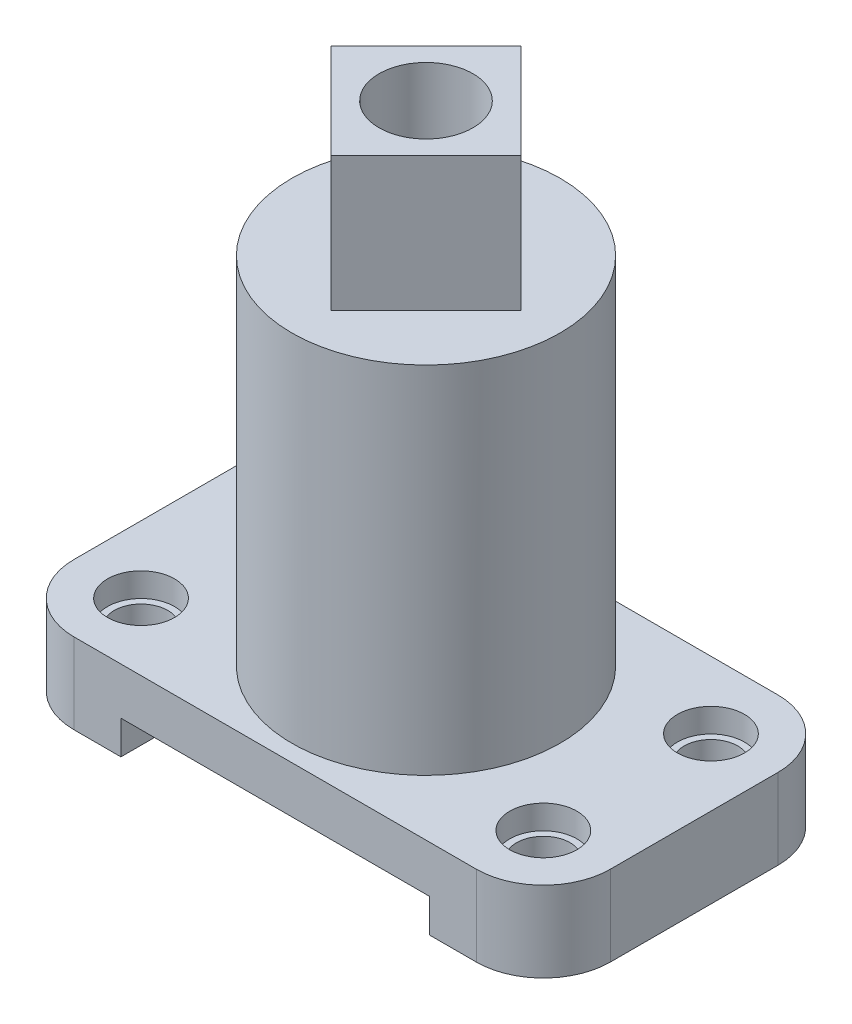
ISO-10303-21;
HEADER;
FILE_DESCRIPTION(('STEP AP214'),'2;1');
FILE_NAME('part.step','',(''),(''),'','','');
FILE_SCHEMA(('AUTOMOTIVE_DESIGN { 1 0 10303 214 1 1 1 1 }'));
ENDSEC;
DATA;
#1=APPLICATION_CONTEXT('core data for automotive mechanical design processes');
#2=APPLICATION_PROTOCOL_DEFINITION('international standard','automotive_design',2000,#1);
#3=PRODUCT_CONTEXT('',#1,'mechanical');
#4=PRODUCT('Part','Part','',(#3));
#5=PRODUCT_RELATED_PRODUCT_CATEGORY('part','',(#4));
#6=PRODUCT_DEFINITION_FORMATION('','',#4);
#7=PRODUCT_DEFINITION_CONTEXT('part definition',#1,'design');
#8=PRODUCT_DEFINITION('design','',#6,#7);
#9=PRODUCT_DEFINITION_SHAPE('','',#8);
#10=(LENGTH_UNIT() NAMED_UNIT(*) SI_UNIT(.MILLI.,.METRE.));
#11=(NAMED_UNIT(*) PLANE_ANGLE_UNIT() SI_UNIT($,.RADIAN.));
#12=(NAMED_UNIT(*) SI_UNIT($,.STERADIAN.) SOLID_ANGLE_UNIT());
#13=UNCERTAINTY_MEASURE_WITH_UNIT(LENGTH_MEASURE(1.E-05),#10,'distance_accuracy_value','');
#14=(GEOMETRIC_REPRESENTATION_CONTEXT(3) GLOBAL_UNCERTAINTY_ASSIGNED_CONTEXT((#13)) GLOBAL_UNIT_ASSIGNED_CONTEXT((#10,
#11,#12)) REPRESENTATION_CONTEXT('',''));
#15=CARTESIAN_POINT('',(0.,0.,0.));
#16=DIRECTION('',(0.,0.,1.));
#17=DIRECTION('',(1.,0.,0.));
#18=AXIS2_PLACEMENT_3D('',#15,#16,#17);
#19=CARTESIAN_POINT('',(30.,0.,-12.5));
#20=DIRECTION('',(0.,-1.,0.));
#21=DIRECTION('',(0.,0.,-1.));
#22=AXIS2_PLACEMENT_3D('',#19,#20,#21);
#23=PLANE('',#22);
#24=DIRECTION('',(0.,0.,1.));
#25=VECTOR('',#24,1.);
#26=CARTESIAN_POINT('',(23.,0.,-12.5));
#27=LINE('',#26,#25);
#28=CARTESIAN_POINT('',(23.,0.,-22.5));
#29=VERTEX_POINT('',#28);
#30=CARTESIAN_POINT('',(23.,0.,22.5));
#31=VERTEX_POINT('',#30);
#32=EDGE_CURVE('E11',#29,#31,#27,.T.);
#33=ORIENTED_EDGE('',*,*,#32,.F.);
#34=DIRECTION('',(-1.,0.,0.));
#35=VECTOR('',#34,1.);
#36=CARTESIAN_POINT('',(-29.9999999999999,0.,-22.5));
#37=LINE('',#36,#35);
#38=CARTESIAN_POINT('',(29.9999999999999,0.,-22.5));
#39=VERTEX_POINT('',#38);
#40=EDGE_CURVE('E171',#39,#29,#37,.T.);
#41=ORIENTED_EDGE('',*,*,#40,.F.);
#42=CARTESIAN_POINT('',(30.,0.,-12.5));
#43=DIRECTION('',(0.,1.,0.));
#44=DIRECTION('',(0.,0.,-1.));
#45=AXIS2_PLACEMENT_3D('',#42,#43,#44);
#46=CIRCLE('',#45,10.);
#47=CARTESIAN_POINT('',(40.,0.,-12.4999999999999));
#48=VERTEX_POINT('',#47);
#49=EDGE_CURVE('E277',#48,#39,#46,.T.);
#50=ORIENTED_EDGE('',*,*,#49,.F.);
#51=DIRECTION('',(0.,0.,-1.));
#52=VECTOR('',#51,1.);
#53=CARTESIAN_POINT('',(40.,0.,12.4999999999999));
#54=LINE('',#53,#52);
#55=CARTESIAN_POINT('',(40.,0.,12.4999999999999));
#56=VERTEX_POINT('',#55);
#57=EDGE_CURVE('E282',#56,#48,#54,.T.);
#58=ORIENTED_EDGE('',*,*,#57,.F.);
#59=CARTESIAN_POINT('',(30.,0.,12.5));
#60=DIRECTION('',(0.,1.,0.));
#61=DIRECTION('',(0.,0.,1.));
#62=AXIS2_PLACEMENT_3D('',#59,#60,#61);
#63=CIRCLE('',#62,10.);
#64=CARTESIAN_POINT('',(29.9999999999999,0.,22.5));
#65=VERTEX_POINT('',#64);
#66=EDGE_CURVE('E311',#65,#56,#63,.T.);
#67=ORIENTED_EDGE('',*,*,#66,.F.);
#68=DIRECTION('',(1.,0.,0.));
#69=VECTOR('',#68,1.);
#70=CARTESIAN_POINT('',(-29.9999999999999,0.,22.5));
#71=LINE('',#70,#69);
#72=EDGE_CURVE('E307',#31,#65,#71,.T.);
#73=ORIENTED_EDGE('',*,*,#72,.F.);
#74=EDGE_LOOP('',(#33,#41,#50,#58,#67,#73));
#75=FACE_BOUND('',#74,.T.);
#76=CARTESIAN_POINT('',(30.,0.,12.5));
#77=DIRECTION('',(0.,1.,0.));
#78=DIRECTION('',(0.,0.,1.));
#79=AXIS2_PLACEMENT_3D('',#76,#77,#78);
#80=CIRCLE('',#79,4.);
#81=CARTESIAN_POINT('',(30.,0.,16.5));
#82=VERTEX_POINT('',#81);
#83=EDGE_CURVE('E274',#82,#82,#80,.T.);
#84=ORIENTED_EDGE('',*,*,#83,.T.);
#85=EDGE_LOOP('',(#84));
#86=FACE_BOUND('',#85,.T.);
#87=CARTESIAN_POINT('',(30.,0.,-12.5));
#88=DIRECTION('',(0.,1.,0.));
#89=DIRECTION('',(0.,0.,1.));
#90=AXIS2_PLACEMENT_3D('',#87,#88,#89);
#91=CIRCLE('',#90,4.);
#92=CARTESIAN_POINT('',(30.,0.,-8.5));
#93=VERTEX_POINT('',#92);
#94=EDGE_CURVE('E262',#93,#93,#91,.T.);
#95=ORIENTED_EDGE('',*,*,#94,.T.);
#96=EDGE_LOOP('',(#95));
#97=FACE_BOUND('',#96,.T.);
#98=ADVANCED_FACE('F33',(#75,#86,#97),#23,.T.);
#99=CARTESIAN_POINT('',(30.,12.,-12.5));
#100=DIRECTION('',(0.,-1.,0.));
#101=DIRECTION('',(0.,0.,-1.));
#102=AXIS2_PLACEMENT_3D('',#99,#100,#101);
#103=CYLINDRICAL_SURFACE('',#102,10.);
#104=ORIENTED_EDGE('',*,*,#49,.T.);
#105=DIRECTION('',(0.,-1.,0.));
#106=VECTOR('',#105,1.);
#107=CARTESIAN_POINT('',(29.9999999999999,12.,-22.5));
#108=LINE('',#107,#106);
#109=CARTESIAN_POINT('',(29.9999999999999,12.,-22.5));
#110=VERTEX_POINT('',#109);
#111=EDGE_CURVE('E334',#110,#39,#108,.T.);
#112=ORIENTED_EDGE('',*,*,#111,.F.);
#113=CARTESIAN_POINT('',(30.,12.,-12.5));
#114=DIRECTION('',(0.,1.,0.));
#115=DIRECTION('',(0.,0.,-1.));
#116=AXIS2_PLACEMENT_3D('',#113,#114,#115);
#117=CIRCLE('',#116,10.);
#118=CARTESIAN_POINT('',(40.,12.,-12.4999999999999));
#119=VERTEX_POINT('',#118);
#120=EDGE_CURVE('E278',#119,#110,#117,.T.);
#121=ORIENTED_EDGE('',*,*,#120,.F.);
#122=DIRECTION('',(0.,-1.,0.));
#123=VECTOR('',#122,1.);
#124=CARTESIAN_POINT('',(40.,12.,-12.4999999999999));
#125=LINE('',#124,#123);
#126=EDGE_CURVE('E296',#119,#48,#125,.T.);
#127=ORIENTED_EDGE('',*,*,#126,.T.);
#128=EDGE_LOOP('',(#104,#112,#121,#127));
#129=FACE_BOUND('',#128,.T.);
#130=ADVANCED_FACE('F35',(#129),#103,.T.);
#131=CARTESIAN_POINT('',(-29.9999999999999,12.,-22.5));
#132=DIRECTION('',(0.,0.,1.));
#133=DIRECTION('',(1.,0.,0.));
#134=AXIS2_PLACEMENT_3D('',#131,#132,#133);
#135=PLANE('',#134);
#136=ORIENTED_EDGE('',*,*,#40,.T.);
#137=DIRECTION('',(0.,1.,0.));
#138=VECTOR('',#137,1.);
#139=CARTESIAN_POINT('',(23.,-5.,-22.5));
#140=LINE('',#139,#138);
#141=CARTESIAN_POINT('',(23.,5.,-22.5));
#142=VERTEX_POINT('',#141);
#143=EDGE_CURVE('E151',#29,#142,#140,.T.);
#144=ORIENTED_EDGE('',*,*,#143,.T.);
#145=DIRECTION('',(-1.,0.,0.));
#146=VECTOR('',#145,1.);
#147=CARTESIAN_POINT('',(-23.,5.,-22.5));
#148=LINE('',#147,#146);
#149=CARTESIAN_POINT('',(-23.,5.,-22.5));
#150=VERTEX_POINT('',#149);
#151=EDGE_CURVE('E162',#142,#150,#148,.T.);
#152=ORIENTED_EDGE('',*,*,#151,.T.);
#153=DIRECTION('',(0.,-1.,0.));
#154=VECTOR('',#153,1.);
#155=CARTESIAN_POINT('',(-23.,-5.,-22.5));
#156=LINE('',#155,#154);
#157=CARTESIAN_POINT('',(-23.,0.,-22.5));
#158=VERTEX_POINT('',#157);
#159=EDGE_CURVE('E159',#150,#158,#156,.T.);
#160=ORIENTED_EDGE('',*,*,#159,.T.);
#161=CARTESIAN_POINT('',(-29.9999999999999,0.,-22.5));
#162=VERTEX_POINT('',#161);
#163=EDGE_CURVE('E299',#158,#162,#37,.T.);
#164=ORIENTED_EDGE('',*,*,#163,.T.);
#165=DIRECTION('',(0.,-1.,0.));
#166=VECTOR('',#165,1.);
#167=CARTESIAN_POINT('',(-29.9999999999999,12.,-22.5));
#168=LINE('',#167,#166);
#169=CARTESIAN_POINT('',(-29.9999999999999,12.,-22.5));
#170=VERTEX_POINT('',#169);
#171=EDGE_CURVE('E331',#170,#162,#168,.T.);
#172=ORIENTED_EDGE('',*,*,#171,.F.);
#173=DIRECTION('',(-1.,0.,0.));
#174=VECTOR('',#173,1.);
#175=CARTESIAN_POINT('',(-29.9999999999999,12.,-22.5));
#176=LINE('',#175,#174);
#177=EDGE_CURVE('E281',#110,#170,#176,.T.);
#178=ORIENTED_EDGE('',*,*,#177,.F.);
#179=ORIENTED_EDGE('',*,*,#111,.T.);
#180=EDGE_LOOP('',(#136,#144,#152,#160,#164,#172,#178,#179));
#181=FACE_BOUND('',#180,.T.);
#182=ADVANCED_FACE('F169',(#181),#135,.F.);
#183=CARTESIAN_POINT('',(-30.,12.,-12.5));
#184=DIRECTION('',(0.,-1.,0.));
#185=DIRECTION('',(0.,0.,-1.));
#186=AXIS2_PLACEMENT_3D('',#183,#184,#185);
#187=CYLINDRICAL_SURFACE('',#186,10.);
#188=CARTESIAN_POINT('',(-30.,0.,-12.5));
#189=DIRECTION('',(0.,1.,0.));
#190=DIRECTION('',(0.,0.,-1.));
#191=AXIS2_PLACEMENT_3D('',#188,#189,#190);
#192=CIRCLE('',#191,10.);
#193=CARTESIAN_POINT('',(-40.,0.,-12.4999999999999));
#194=VERTEX_POINT('',#193);
#195=EDGE_CURVE('E301',#162,#194,#192,.T.);
#196=ORIENTED_EDGE('',*,*,#195,.T.);
#197=DIRECTION('',(0.,-1.,0.));
#198=VECTOR('',#197,1.);
#199=CARTESIAN_POINT('',(-40.,12.,-12.4999999999999));
#200=LINE('',#199,#198);
#201=CARTESIAN_POINT('',(-40.,12.,-12.4999999999999));
#202=VERTEX_POINT('',#201);
#203=EDGE_CURVE('E328',#202,#194,#200,.T.);
#204=ORIENTED_EDGE('',*,*,#203,.F.);
#205=CARTESIAN_POINT('',(-30.,12.,-12.5));
#206=DIRECTION('',(0.,1.,0.));
#207=DIRECTION('',(0.,0.,-1.));
#208=AXIS2_PLACEMENT_3D('',#205,#206,#207);
#209=CIRCLE('',#208,10.);
#210=EDGE_CURVE('E284',#170,#202,#209,.T.);
#211=ORIENTED_EDGE('',*,*,#210,.F.);
#212=ORIENTED_EDGE('',*,*,#171,.T.);
#213=EDGE_LOOP('',(#196,#204,#211,#212));
#214=FACE_BOUND('',#213,.T.);
#215=ADVANCED_FACE('F352',(#214),#187,.T.);
#216=CARTESIAN_POINT('',(-40.,12.,12.4999999999999));
#217=DIRECTION('',(1.,0.,0.));
#218=DIRECTION('',(0.,0.,-1.));
#219=AXIS2_PLACEMENT_3D('',#216,#217,#218);
#220=PLANE('',#219);
#221=DIRECTION('',(0.,0.,1.));
#222=VECTOR('',#221,1.);
#223=CARTESIAN_POINT('',(-40.,0.,12.4999999999999));
#224=LINE('',#223,#222);
#225=CARTESIAN_POINT('',(-40.,0.,12.4999999999999));
#226=VERTEX_POINT('',#225);
#227=EDGE_CURVE('E303',#194,#226,#224,.T.);
#228=ORIENTED_EDGE('',*,*,#227,.T.);
#229=DIRECTION('',(0.,-1.,0.));
#230=VECTOR('',#229,1.);
#231=CARTESIAN_POINT('',(-40.,12.,12.4999999999999));
#232=LINE('',#231,#230);
#233=CARTESIAN_POINT('',(-40.,12.,12.4999999999999));
#234=VERTEX_POINT('',#233);
#235=EDGE_CURVE('E325',#234,#226,#232,.T.);
#236=ORIENTED_EDGE('',*,*,#235,.F.);
#237=DIRECTION('',(0.,0.,1.));
#238=VECTOR('',#237,1.);
#239=CARTESIAN_POINT('',(-40.,12.,12.4999999999999));
#240=LINE('',#239,#238);
#241=EDGE_CURVE('E286',#202,#234,#240,.T.);
#242=ORIENTED_EDGE('',*,*,#241,.F.);
#243=ORIENTED_EDGE('',*,*,#203,.T.);
#244=EDGE_LOOP('',(#228,#236,#242,#243));
#245=FACE_BOUND('',#244,.T.);
#246=ADVANCED_FACE('F356',(#245),#220,.F.);
#247=CARTESIAN_POINT('',(-30.,12.,12.5));
#248=DIRECTION('',(0.,-1.,0.));
#249=DIRECTION('',(0.,0.,-1.));
#250=AXIS2_PLACEMENT_3D('',#247,#248,#249);
#251=CYLINDRICAL_SURFACE('',#250,10.);
#252=CARTESIAN_POINT('',(-30.,0.,12.5));
#253=DIRECTION('',(0.,1.,0.));
#254=DIRECTION('',(0.,0.,-1.));
#255=AXIS2_PLACEMENT_3D('',#252,#253,#254);
#256=CIRCLE('',#255,10.);
#257=CARTESIAN_POINT('',(-29.9999999999999,0.,22.5));
#258=VERTEX_POINT('',#257);
#259=EDGE_CURVE('E305',#226,#258,#256,.T.);
#260=ORIENTED_EDGE('',*,*,#259,.T.);
#261=DIRECTION('',(0.,-1.,0.));
#262=VECTOR('',#261,1.);
#263=CARTESIAN_POINT('',(-29.9999999999999,12.,22.5));
#264=LINE('',#263,#262);
#265=CARTESIAN_POINT('',(-29.9999999999999,12.,22.5));
#266=VERTEX_POINT('',#265);
#267=EDGE_CURVE('E322',#266,#258,#264,.T.);
#268=ORIENTED_EDGE('',*,*,#267,.F.);
#269=CARTESIAN_POINT('',(-30.,12.,12.5));
#270=DIRECTION('',(0.,1.,0.));
#271=DIRECTION('',(0.,0.,-1.));
#272=AXIS2_PLACEMENT_3D('',#269,#270,#271);
#273=CIRCLE('',#272,10.);
#274=EDGE_CURVE('E288',#234,#266,#273,.T.);
#275=ORIENTED_EDGE('',*,*,#274,.F.);
#276=ORIENTED_EDGE('',*,*,#235,.T.);
#277=EDGE_LOOP('',(#260,#268,#275,#276));
#278=FACE_BOUND('',#277,.T.);
#279=ADVANCED_FACE('F377',(#278),#251,.T.);
#280=CARTESIAN_POINT('',(-29.9999999999999,12.,22.5));
#281=DIRECTION('',(0.,0.,-1.));
#282=DIRECTION('',(-1.,0.,0.));
#283=AXIS2_PLACEMENT_3D('',#280,#281,#282);
#284=PLANE('',#283);
#285=DIRECTION('',(-1.,0.,0.));
#286=VECTOR('',#285,1.);
#287=CARTESIAN_POINT('',(-23.,5.,22.5));
#288=LINE('',#287,#286);
#289=CARTESIAN_POINT('',(23.,5.,22.5));
#290=VERTEX_POINT('',#289);
#291=CARTESIAN_POINT('',(-23.,5.,22.5));
#292=VERTEX_POINT('',#291);
#293=EDGE_CURVE('E173',#290,#292,#288,.T.);
#294=ORIENTED_EDGE('',*,*,#293,.F.);
#295=DIRECTION('',(0.,1.,0.));
#296=VECTOR('',#295,1.);
#297=CARTESIAN_POINT('',(23.,-5.,22.5));
#298=LINE('',#297,#296);
#299=EDGE_CURVE('E154',#31,#290,#298,.T.);
#300=ORIENTED_EDGE('',*,*,#299,.F.);
#301=ORIENTED_EDGE('',*,*,#72,.T.);
#302=DIRECTION('',(0.,-1.,0.));
#303=VECTOR('',#302,1.);
#304=CARTESIAN_POINT('',(29.9999999999999,12.,22.5));
#305=LINE('',#304,#303);
#306=CARTESIAN_POINT('',(29.9999999999999,12.,22.5));
#307=VERTEX_POINT('',#306);
#308=EDGE_CURVE('E319',#307,#65,#305,.T.);
#309=ORIENTED_EDGE('',*,*,#308,.F.);
#310=DIRECTION('',(1.,0.,0.));
#311=VECTOR('',#310,1.);
#312=CARTESIAN_POINT('',(-29.9999999999999,12.,22.5));
#313=LINE('',#312,#311);
#314=EDGE_CURVE('E290',#266,#307,#313,.T.);
#315=ORIENTED_EDGE('',*,*,#314,.F.);
#316=ORIENTED_EDGE('',*,*,#267,.T.);
#317=CARTESIAN_POINT('',(-23.,0.,22.5));
#318=VERTEX_POINT('',#317);
#319=EDGE_CURVE('E308',#258,#318,#71,.T.);
#320=ORIENTED_EDGE('',*,*,#319,.T.);
#321=DIRECTION('',(0.,-1.,0.));
#322=VECTOR('',#321,1.);
#323=CARTESIAN_POINT('',(-23.,-5.,22.5));
#324=LINE('',#323,#322);
#325=EDGE_CURVE('E48',#292,#318,#324,.T.);
#326=ORIENTED_EDGE('',*,*,#325,.F.);
#327=EDGE_LOOP('',(#294,#300,#301,#309,#315,#316,#320,#326));
#328=FACE_BOUND('',#327,.T.);
#329=ADVANCED_FACE('F373',(#328),#284,.F.);
#330=CARTESIAN_POINT('',(30.,12.,12.5));
#331=DIRECTION('',(0.,-1.,0.));
#332=DIRECTION('',(0.,0.,-1.));
#333=AXIS2_PLACEMENT_3D('',#330,#331,#332);
#334=CYLINDRICAL_SURFACE('',#333,10.);
#335=ORIENTED_EDGE('',*,*,#66,.T.);
#336=DIRECTION('',(0.,-1.,0.));
#337=VECTOR('',#336,1.);
#338=CARTESIAN_POINT('',(40.,12.,12.4999999999999));
#339=LINE('',#338,#337);
#340=CARTESIAN_POINT('',(40.,12.,12.4999999999999));
#341=VERTEX_POINT('',#340);
#342=EDGE_CURVE('E316',#341,#56,#339,.T.);
#343=ORIENTED_EDGE('',*,*,#342,.F.);
#344=CARTESIAN_POINT('',(30.,12.,12.5));
#345=DIRECTION('',(0.,1.,0.));
#346=DIRECTION('',(0.,0.,1.));
#347=AXIS2_PLACEMENT_3D('',#344,#345,#346);
#348=CIRCLE('',#347,10.);
#349=EDGE_CURVE('E292',#307,#341,#348,.T.);
#350=ORIENTED_EDGE('',*,*,#349,.F.);
#351=ORIENTED_EDGE('',*,*,#308,.T.);
#352=EDGE_LOOP('',(#335,#343,#350,#351));
#353=FACE_BOUND('',#352,.T.);
#354=ADVANCED_FACE('F382',(#353),#334,.T.);
#355=CARTESIAN_POINT('',(40.,12.,12.4999999999999));
#356=DIRECTION('',(-1.,0.,0.));
#357=DIRECTION('',(0.,0.,1.));
#358=AXIS2_PLACEMENT_3D('',#355,#356,#357);
#359=PLANE('',#358);
#360=ORIENTED_EDGE('',*,*,#57,.T.);
#361=ORIENTED_EDGE('',*,*,#126,.F.);
#362=DIRECTION('',(0.,0.,-1.));
#363=VECTOR('',#362,1.);
#364=CARTESIAN_POINT('',(40.,12.,12.4999999999999));
#365=LINE('',#364,#363);
#366=EDGE_CURVE('E294',#341,#119,#365,.T.);
#367=ORIENTED_EDGE('',*,*,#366,.F.);
#368=ORIENTED_EDGE('',*,*,#342,.T.);
#369=EDGE_LOOP('',(#360,#361,#367,#368));
#370=FACE_BOUND('',#369,.T.);
#371=ADVANCED_FACE('F384',(#370),#359,.F.);
#372=CARTESIAN_POINT('',(30.,12.,-12.5));
#373=DIRECTION('',(0.,-1.,0.));
#374=DIRECTION('',(0.,0.,-1.));
#375=AXIS2_PLACEMENT_3D('',#372,#373,#374);
#376=PLANE('',#375);
#377=CARTESIAN_POINT('',(0.,12.,0.));
#378=DIRECTION('',(0.,-1.,0.));
#379=DIRECTION('',(0.,0.,-1.));
#380=AXIS2_PLACEMENT_3D('',#377,#378,#379);
#381=CIRCLE('',#380,20.);
#382=CARTESIAN_POINT('',(0.,12.,-20.));
#383=VERTEX_POINT('',#382);
#384=EDGE_CURVE('E336',#383,#383,#381,.F.);
#385=ORIENTED_EDGE('',*,*,#384,.F.);
#386=EDGE_LOOP('',(#385));
#387=FACE_BOUND('',#386,.T.);
#388=CARTESIAN_POINT('',(-30.,12.,12.5));
#389=DIRECTION('',(0.,1.,0.));
#390=DIRECTION('',(0.,0.,1.));
#391=AXIS2_PLACEMENT_3D('',#388,#389,#390);
#392=CIRCLE('',#391,5.);
#393=CARTESIAN_POINT('',(-30.,12.,17.5));
#394=VERTEX_POINT('',#393);
#395=EDGE_CURVE('E229',#394,#394,#392,.T.);
#396=ORIENTED_EDGE('',*,*,#395,.F.);
#397=EDGE_LOOP('',(#396));
#398=FACE_BOUND('',#397,.T.);
#399=CARTESIAN_POINT('',(-30.,12.,-12.5));
#400=DIRECTION('',(0.,1.,0.));
#401=DIRECTION('',(0.,0.,1.));
#402=AXIS2_PLACEMENT_3D('',#399,#400,#401);
#403=CIRCLE('',#402,5.);
#404=CARTESIAN_POINT('',(-30.,12.,-7.5));
#405=VERTEX_POINT('',#404);
#406=EDGE_CURVE('E241',#405,#405,#403,.T.);
#407=ORIENTED_EDGE('',*,*,#406,.F.);
#408=EDGE_LOOP('',(#407));
#409=FACE_BOUND('',#408,.T.);
#410=CARTESIAN_POINT('',(30.,12.,-12.5));
#411=DIRECTION('',(0.,1.,0.));
#412=DIRECTION('',(0.,0.,1.));
#413=AXIS2_PLACEMENT_3D('',#410,#411,#412);
#414=CIRCLE('',#413,5.);
#415=CARTESIAN_POINT('',(30.,12.,-7.5));
#416=VERTEX_POINT('',#415);
#417=EDGE_CURVE('E253',#416,#416,#414,.T.);
#418=ORIENTED_EDGE('',*,*,#417,.F.);
#419=EDGE_LOOP('',(#418));
#420=FACE_BOUND('',#419,.T.);
#421=CARTESIAN_POINT('',(30.,12.,12.5));
#422=DIRECTION('',(0.,1.,0.));
#423=DIRECTION('',(0.,0.,1.));
#424=AXIS2_PLACEMENT_3D('',#421,#422,#423);
#425=CIRCLE('',#424,5.);
#426=CARTESIAN_POINT('',(30.,12.,17.5));
#427=VERTEX_POINT('',#426);
#428=EDGE_CURVE('E265',#427,#427,#425,.T.);
#429=ORIENTED_EDGE('',*,*,#428,.F.);
#430=EDGE_LOOP('',(#429));
#431=FACE_BOUND('',#430,.T.);
#432=ORIENTED_EDGE('',*,*,#120,.T.);
#433=ORIENTED_EDGE('',*,*,#177,.T.);
#434=ORIENTED_EDGE('',*,*,#210,.T.);
#435=ORIENTED_EDGE('',*,*,#241,.T.);
#436=ORIENTED_EDGE('',*,*,#274,.T.);
#437=ORIENTED_EDGE('',*,*,#314,.T.);
#438=ORIENTED_EDGE('',*,*,#349,.T.);
#439=ORIENTED_EDGE('',*,*,#366,.T.);
#440=EDGE_LOOP('',(#432,#433,#434,#435,#436,#437,#438,#439));
#441=FACE_BOUND('',#440,.T.);
#442=ADVANCED_FACE('F360',(#387,#398,#409,#420,#431,#441),#376,.F.);
#443=DIRECTION('',(0.,0.,-1.));
#444=VECTOR('',#443,1.);
#445=CARTESIAN_POINT('',(-23.,0.,-12.5));
#446=LINE('',#445,#444);
#447=EDGE_CURVE('E41',#318,#158,#446,.T.);
#448=ORIENTED_EDGE('',*,*,#447,.F.);
#449=ORIENTED_EDGE('',*,*,#319,.F.);
#450=ORIENTED_EDGE('',*,*,#259,.F.);
#451=ORIENTED_EDGE('',*,*,#227,.F.);
#452=ORIENTED_EDGE('',*,*,#195,.F.);
#453=ORIENTED_EDGE('',*,*,#163,.F.);
#454=EDGE_LOOP('',(#448,#449,#450,#451,#452,#453));
#455=FACE_BOUND('',#454,.T.);
#456=CARTESIAN_POINT('',(-30.,0.,12.5));
#457=DIRECTION('',(0.,1.,0.));
#458=DIRECTION('',(0.,0.,1.));
#459=AXIS2_PLACEMENT_3D('',#456,#457,#458);
#460=CIRCLE('',#459,4.);
#461=CARTESIAN_POINT('',(-30.,0.,16.5));
#462=VERTEX_POINT('',#461);
#463=EDGE_CURVE('E238',#462,#462,#460,.T.);
#464=ORIENTED_EDGE('',*,*,#463,.T.);
#465=EDGE_LOOP('',(#464));
#466=FACE_BOUND('',#465,.T.);
#467=CARTESIAN_POINT('',(-30.,0.,-12.5));
#468=DIRECTION('',(0.,1.,0.));
#469=DIRECTION('',(0.,0.,1.));
#470=AXIS2_PLACEMENT_3D('',#467,#468,#469);
#471=CIRCLE('',#470,4.);
#472=CARTESIAN_POINT('',(-30.,0.,-8.5));
#473=VERTEX_POINT('',#472);
#474=EDGE_CURVE('E250',#473,#473,#471,.T.);
#475=ORIENTED_EDGE('',*,*,#474,.T.);
#476=EDGE_LOOP('',(#475));
#477=FACE_BOUND('',#476,.T.);
#478=ADVANCED_FACE('F346',(#455,#466,#477),#23,.T.);
#479=CARTESIAN_POINT('',(30.,12.,12.5));
#480=DIRECTION('',(0.,1.,0.));
#481=DIRECTION('',(0.,0.,1.));
#482=AXIS2_PLACEMENT_3D('',#479,#480,#481);
#483=CYLINDRICAL_SURFACE('',#482,4.);
#484=ORIENTED_EDGE('',*,*,#83,.F.);
#485=EDGE_LOOP('',(#484));
#486=FACE_BOUND('',#485,.T.);
#487=CARTESIAN_POINT('',(30.,8.42,12.5));
#488=DIRECTION('',(0.,1.,0.));
#489=DIRECTION('',(0.,0.,1.));
#490=AXIS2_PLACEMENT_3D('',#487,#488,#489);
#491=CIRCLE('',#490,4.);
#492=CARTESIAN_POINT('',(30.,8.42,16.5));
#493=VERTEX_POINT('',#492);
#494=EDGE_CURVE('E271',#493,#493,#491,.T.);
#495=ORIENTED_EDGE('',*,*,#494,.T.);
#496=EDGE_LOOP('',(#495));
#497=FACE_BOUND('',#496,.T.);
#498=ADVANCED_FACE('F400',(#486,#497),#483,.F.);
#499=CARTESIAN_POINT('',(34.,8.42,12.5));
#500=DIRECTION('',(0.,-1.,0.));
#501=DIRECTION('',(0.,0.,-1.));
#502=AXIS2_PLACEMENT_3D('',#499,#500,#501);
#503=PLANE('',#502);
#504=ORIENTED_EDGE('',*,*,#494,.F.);
#505=EDGE_LOOP('',(#504));
#506=FACE_BOUND('',#505,.T.);
#507=CARTESIAN_POINT('',(30.,8.42,12.5));
#508=DIRECTION('',(0.,1.,0.));
#509=DIRECTION('',(0.,0.,1.));
#510=AXIS2_PLACEMENT_3D('',#507,#508,#509);
#511=CIRCLE('',#510,5.);
#512=CARTESIAN_POINT('',(30.,8.42,17.5));
#513=VERTEX_POINT('',#512);
#514=EDGE_CURVE('E268',#513,#513,#511,.T.);
#515=ORIENTED_EDGE('',*,*,#514,.T.);
#516=EDGE_LOOP('',(#515));
#517=FACE_BOUND('',#516,.T.);
#518=ADVANCED_FACE('F404',(#506,#517),#503,.F.);
#519=CARTESIAN_POINT('',(30.,12.,12.5));
#520=DIRECTION('',(0.,1.,0.));
#521=DIRECTION('',(0.,0.,1.));
#522=AXIS2_PLACEMENT_3D('',#519,#520,#521);
#523=CYLINDRICAL_SURFACE('',#522,5.);
#524=ORIENTED_EDGE('',*,*,#514,.F.);
#525=EDGE_LOOP('',(#524));
#526=FACE_BOUND('',#525,.T.);
#527=ORIENTED_EDGE('',*,*,#428,.T.);
#528=EDGE_LOOP('',(#527));
#529=FACE_BOUND('',#528,.T.);
#530=ADVANCED_FACE('F410',(#526,#529),#523,.F.);
#531=CARTESIAN_POINT('',(30.,12.,-12.5));
#532=DIRECTION('',(0.,1.,0.));
#533=DIRECTION('',(0.,0.,1.));
#534=AXIS2_PLACEMENT_3D('',#531,#532,#533);
#535=CYLINDRICAL_SURFACE('',#534,4.);
#536=ORIENTED_EDGE('',*,*,#94,.F.);
#537=EDGE_LOOP('',(#536));
#538=FACE_BOUND('',#537,.T.);
#539=CARTESIAN_POINT('',(30.,8.42,-12.5));
#540=DIRECTION('',(0.,1.,0.));
#541=DIRECTION('',(0.,0.,1.));
#542=AXIS2_PLACEMENT_3D('',#539,#540,#541);
#543=CIRCLE('',#542,4.);
#544=CARTESIAN_POINT('',(30.,8.42,-8.5));
#545=VERTEX_POINT('',#544);
#546=EDGE_CURVE('E259',#545,#545,#543,.T.);
#547=ORIENTED_EDGE('',*,*,#546,.T.);
#548=EDGE_LOOP('',(#547));
#549=FACE_BOUND('',#548,.T.);
#550=ADVANCED_FACE('F418',(#538,#549),#535,.F.);
#551=CARTESIAN_POINT('',(34.,8.42,-12.5));
#552=DIRECTION('',(0.,-1.,0.));
#553=DIRECTION('',(0.,0.,-1.));
#554=AXIS2_PLACEMENT_3D('',#551,#552,#553);
#555=PLANE('',#554);
#556=ORIENTED_EDGE('',*,*,#546,.F.);
#557=EDGE_LOOP('',(#556));
#558=FACE_BOUND('',#557,.T.);
#559=CARTESIAN_POINT('',(30.,8.42,-12.5));
#560=DIRECTION('',(0.,1.,0.));
#561=DIRECTION('',(0.,0.,1.));
#562=AXIS2_PLACEMENT_3D('',#559,#560,#561);
#563=CIRCLE('',#562,5.);
#564=CARTESIAN_POINT('',(30.,8.42,-7.5));
#565=VERTEX_POINT('',#564);
#566=EDGE_CURVE('E256',#565,#565,#563,.T.);
#567=ORIENTED_EDGE('',*,*,#566,.T.);
#568=EDGE_LOOP('',(#567));
#569=FACE_BOUND('',#568,.T.);
#570=ADVANCED_FACE('F422',(#558,#569),#555,.F.);
#571=CARTESIAN_POINT('',(30.,12.,-12.5));
#572=DIRECTION('',(0.,1.,0.));
#573=DIRECTION('',(0.,0.,1.));
#574=AXIS2_PLACEMENT_3D('',#571,#572,#573);
#575=CYLINDRICAL_SURFACE('',#574,5.);
#576=ORIENTED_EDGE('',*,*,#566,.F.);
#577=EDGE_LOOP('',(#576));
#578=FACE_BOUND('',#577,.T.);
#579=ORIENTED_EDGE('',*,*,#417,.T.);
#580=EDGE_LOOP('',(#579));
#581=FACE_BOUND('',#580,.T.);
#582=ADVANCED_FACE('F426',(#578,#581),#575,.F.);
#583=CARTESIAN_POINT('',(-30.,12.,-12.5));
#584=DIRECTION('',(0.,1.,0.));
#585=DIRECTION('',(0.,0.,1.));
#586=AXIS2_PLACEMENT_3D('',#583,#584,#585);
#587=CYLINDRICAL_SURFACE('',#586,4.);
#588=ORIENTED_EDGE('',*,*,#474,.F.);
#589=EDGE_LOOP('',(#588));
#590=FACE_BOUND('',#589,.T.);
#591=CARTESIAN_POINT('',(-30.,8.42,-12.5));
#592=DIRECTION('',(0.,1.,0.));
#593=DIRECTION('',(0.,0.,1.));
#594=AXIS2_PLACEMENT_3D('',#591,#592,#593);
#595=CIRCLE('',#594,4.);
#596=CARTESIAN_POINT('',(-30.,8.42,-8.5));
#597=VERTEX_POINT('',#596);
#598=EDGE_CURVE('E247',#597,#597,#595,.T.);
#599=ORIENTED_EDGE('',*,*,#598,.T.);
#600=EDGE_LOOP('',(#599));
#601=FACE_BOUND('',#600,.T.);
#602=ADVANCED_FACE('F430',(#590,#601),#587,.F.);
#603=CARTESIAN_POINT('',(-26.,8.42,-12.5));
#604=DIRECTION('',(0.,-1.,0.));
#605=DIRECTION('',(0.,0.,-1.));
#606=AXIS2_PLACEMENT_3D('',#603,#604,#605);
#607=PLANE('',#606);
#608=ORIENTED_EDGE('',*,*,#598,.F.);
#609=EDGE_LOOP('',(#608));
#610=FACE_BOUND('',#609,.T.);
#611=CARTESIAN_POINT('',(-30.,8.42,-12.5));
#612=DIRECTION('',(0.,1.,0.));
#613=DIRECTION('',(0.,0.,1.));
#614=AXIS2_PLACEMENT_3D('',#611,#612,#613);
#615=CIRCLE('',#614,5.);
#616=CARTESIAN_POINT('',(-30.,8.42,-7.5));
#617=VERTEX_POINT('',#616);
#618=EDGE_CURVE('E244',#617,#617,#615,.T.);
#619=ORIENTED_EDGE('',*,*,#618,.T.);
#620=EDGE_LOOP('',(#619));
#621=FACE_BOUND('',#620,.T.);
#622=ADVANCED_FACE('F434',(#610,#621),#607,.F.);
#623=CARTESIAN_POINT('',(-30.,12.,-12.5));
#624=DIRECTION('',(0.,1.,0.));
#625=DIRECTION('',(0.,0.,1.));
#626=AXIS2_PLACEMENT_3D('',#623,#624,#625);
#627=CYLINDRICAL_SURFACE('',#626,5.);
#628=ORIENTED_EDGE('',*,*,#618,.F.);
#629=EDGE_LOOP('',(#628));
#630=FACE_BOUND('',#629,.T.);
#631=ORIENTED_EDGE('',*,*,#406,.T.);
#632=EDGE_LOOP('',(#631));
#633=FACE_BOUND('',#632,.T.);
#634=ADVANCED_FACE('F438',(#630,#633),#627,.F.);
#635=CARTESIAN_POINT('',(-30.,12.,12.5));
#636=DIRECTION('',(0.,1.,0.));
#637=DIRECTION('',(0.,0.,1.));
#638=AXIS2_PLACEMENT_3D('',#635,#636,#637);
#639=CYLINDRICAL_SURFACE('',#638,4.);
#640=ORIENTED_EDGE('',*,*,#463,.F.);
#641=EDGE_LOOP('',(#640));
#642=FACE_BOUND('',#641,.T.);
#643=CARTESIAN_POINT('',(-30.,8.42,12.5));
#644=DIRECTION('',(0.,1.,0.));
#645=DIRECTION('',(0.,0.,1.));
#646=AXIS2_PLACEMENT_3D('',#643,#644,#645);
#647=CIRCLE('',#646,4.);
#648=CARTESIAN_POINT('',(-30.,8.42,16.5));
#649=VERTEX_POINT('',#648);
#650=EDGE_CURVE('E235',#649,#649,#647,.T.);
#651=ORIENTED_EDGE('',*,*,#650,.T.);
#652=EDGE_LOOP('',(#651));
#653=FACE_BOUND('',#652,.T.);
#654=ADVANCED_FACE('F442',(#642,#653),#639,.F.);
#655=CARTESIAN_POINT('',(-26.,8.42,12.5));
#656=DIRECTION('',(0.,-1.,0.));
#657=DIRECTION('',(0.,0.,-1.));
#658=AXIS2_PLACEMENT_3D('',#655,#656,#657);
#659=PLANE('',#658);
#660=ORIENTED_EDGE('',*,*,#650,.F.);
#661=EDGE_LOOP('',(#660));
#662=FACE_BOUND('',#661,.T.);
#663=CARTESIAN_POINT('',(-30.,8.42,12.5));
#664=DIRECTION('',(0.,1.,0.));
#665=DIRECTION('',(0.,0.,1.));
#666=AXIS2_PLACEMENT_3D('',#663,#664,#665);
#667=CIRCLE('',#666,5.);
#668=CARTESIAN_POINT('',(-30.,8.42,17.5));
#669=VERTEX_POINT('',#668);
#670=EDGE_CURVE('E232',#669,#669,#667,.T.);
#671=ORIENTED_EDGE('',*,*,#670,.T.);
#672=EDGE_LOOP('',(#671));
#673=FACE_BOUND('',#672,.T.);
#674=ADVANCED_FACE('F446',(#662,#673),#659,.F.);
#675=CARTESIAN_POINT('',(-30.,12.,12.5));
#676=DIRECTION('',(0.,1.,0.));
#677=DIRECTION('',(0.,0.,1.));
#678=AXIS2_PLACEMENT_3D('',#675,#676,#677);
#679=CYLINDRICAL_SURFACE('',#678,5.);
#680=ORIENTED_EDGE('',*,*,#670,.F.);
#681=EDGE_LOOP('',(#680));
#682=FACE_BOUND('',#681,.T.);
#683=ORIENTED_EDGE('',*,*,#395,.T.);
#684=EDGE_LOOP('',(#683));
#685=FACE_BOUND('',#684,.T.);
#686=ADVANCED_FACE('F450',(#682,#685),#679,.F.);
#687=CARTESIAN_POINT('',(0.,65.,0.));
#688=DIRECTION('',(0.,-1.,0.));
#689=DIRECTION('',(0.,0.,-1.));
#690=AXIS2_PLACEMENT_3D('',#687,#688,#689);
#691=CYLINDRICAL_SURFACE('',#690,20.);
#692=CARTESIAN_POINT('',(0.,65.,0.));
#693=DIRECTION('',(0.,1.,0.));
#694=DIRECTION('',(0.,0.,1.));
#695=AXIS2_PLACEMENT_3D('',#692,#693,#694);
#696=CIRCLE('',#695,20.);
#697=CARTESIAN_POINT('',(0.,65.,20.));
#698=VERTEX_POINT('',#697);
#699=EDGE_CURVE('E226',#698,#698,#696,.T.);
#700=ORIENTED_EDGE('',*,*,#699,.F.);
#701=EDGE_LOOP('',(#700));
#702=FACE_BOUND('',#701,.T.);
#703=ORIENTED_EDGE('',*,*,#384,.T.);
#704=EDGE_LOOP('',(#703));
#705=FACE_BOUND('',#704,.T.);
#706=ADVANCED_FACE('F454',(#702,#705),#691,.T.);
#707=CARTESIAN_POINT('',(0.,65.,0.));
#708=DIRECTION('',(0.,1.,0.));
#709=DIRECTION('',(0.,0.,1.));
#710=AXIS2_PLACEMENT_3D('',#707,#708,#709);
#711=PLANE('',#710);
#712=DIRECTION('',(-0.707106781186549,0.,-0.707106781186546));
#713=VECTOR('',#712,1.);
#714=CARTESIAN_POINT('',(14.142135623731,65.,0.));
#715=LINE('',#714,#713);
#716=CARTESIAN_POINT('',(14.142135623731,65.,0.));
#717=VERTEX_POINT('',#716);
#718=CARTESIAN_POINT('',(0.,65.,-14.142135623731));
#719=VERTEX_POINT('',#718);
#720=EDGE_CURVE('E56',#717,#719,#715,.T.);
#721=ORIENTED_EDGE('',*,*,#720,.F.);
#722=DIRECTION('',(0.707106781186546,0.,-0.707106781186549));
#723=VECTOR('',#722,1.);
#724=CARTESIAN_POINT('',(0.,65.,14.1421356237309));
#725=LINE('',#724,#723);
#726=CARTESIAN_POINT('',(0.,65.,14.1421356237309));
#727=VERTEX_POINT('',#726);
#728=EDGE_CURVE('E200',#727,#717,#725,.T.);
#729=ORIENTED_EDGE('',*,*,#728,.F.);
#730=DIRECTION('',(0.707106781186549,0.,0.707106781186546));
#731=VECTOR('',#730,1.);
#732=CARTESIAN_POINT('',(0.,65.,14.1421356237309));
#733=LINE('',#732,#731);
#734=CARTESIAN_POINT('',(-14.142135623731,65.,0.));
#735=VERTEX_POINT('',#734);
#736=EDGE_CURVE('E211',#735,#727,#733,.T.);
#737=ORIENTED_EDGE('',*,*,#736,.F.);
#738=DIRECTION('',(-0.707106781186546,0.,0.707106781186549));
#739=VECTOR('',#738,1.);
#740=CARTESIAN_POINT('',(-14.142135623731,65.,0.));
#741=LINE('',#740,#739);
#742=EDGE_CURVE('E208',#719,#735,#741,.T.);
#743=ORIENTED_EDGE('',*,*,#742,.F.);
#744=EDGE_LOOP('',(#721,#729,#737,#743));
#745=FACE_BOUND('',#744,.T.);
#746=ORIENTED_EDGE('',*,*,#699,.T.);
#747=EDGE_LOOP('',(#746));
#748=FACE_BOUND('',#747,.T.);
#749=ADVANCED_FACE('F458',(#745,#748),#711,.T.);
#750=CARTESIAN_POINT('',(14.142135623731,85.,0.));
#751=DIRECTION('',(-0.707106781186546,0.,0.707106781186549));
#752=DIRECTION('',(0.707106781186549,0.,0.707106781186546));
#753=AXIS2_PLACEMENT_3D('',#750,#751,#752);
#754=PLANE('',#753);
#755=ORIENTED_EDGE('',*,*,#720,.T.);
#756=DIRECTION('',(0.,-1.,0.));
#757=VECTOR('',#756,1.);
#758=CARTESIAN_POINT('',(0.,85.,-14.142135623731));
#759=LINE('',#758,#757);
#760=CARTESIAN_POINT('',(0.,85.,-14.142135623731));
#761=VERTEX_POINT('',#760);
#762=EDGE_CURVE('E223',#761,#719,#759,.T.);
#763=ORIENTED_EDGE('',*,*,#762,.F.);
#764=DIRECTION('',(-0.707106781186549,0.,-0.707106781186546));
#765=VECTOR('',#764,1.);
#766=CARTESIAN_POINT('',(14.142135623731,85.,0.));
#767=LINE('',#766,#765);
#768=CARTESIAN_POINT('',(14.142135623731,85.,0.));
#769=VERTEX_POINT('',#768);
#770=EDGE_CURVE('E196',#769,#761,#767,.T.);
#771=ORIENTED_EDGE('',*,*,#770,.F.);
#772=DIRECTION('',(0.,-1.,0.));
#773=VECTOR('',#772,1.);
#774=CARTESIAN_POINT('',(14.142135623731,85.,0.));
#775=LINE('',#774,#773);
#776=EDGE_CURVE('E206',#769,#717,#775,.T.);
#777=ORIENTED_EDGE('',*,*,#776,.T.);
#778=EDGE_LOOP('',(#755,#763,#771,#777));
#779=FACE_BOUND('',#778,.T.);
#780=ADVANCED_FACE('F462',(#779),#754,.F.);
#781=CARTESIAN_POINT('',(-14.142135623731,85.,0.));
#782=DIRECTION('',(0.707106781186549,0.,0.707106781186546));
#783=DIRECTION('',(0.707106781186546,0.,-0.707106781186549));
#784=AXIS2_PLACEMENT_3D('',#781,#782,#783);
#785=PLANE('',#784);
#786=ORIENTED_EDGE('',*,*,#742,.T.);
#787=DIRECTION('',(0.,-1.,0.));
#788=VECTOR('',#787,1.);
#789=CARTESIAN_POINT('',(-14.142135623731,85.,0.));
#790=LINE('',#789,#788);
#791=CARTESIAN_POINT('',(-14.142135623731,85.,0.));
#792=VERTEX_POINT('',#791);
#793=EDGE_CURVE('E220',#792,#735,#790,.T.);
#794=ORIENTED_EDGE('',*,*,#793,.F.);
#795=DIRECTION('',(-0.707106781186546,0.,0.707106781186549));
#796=VECTOR('',#795,1.);
#797=CARTESIAN_POINT('',(-14.142135623731,85.,0.));
#798=LINE('',#797,#796);
#799=EDGE_CURVE('E199',#761,#792,#798,.T.);
#800=ORIENTED_EDGE('',*,*,#799,.F.);
#801=ORIENTED_EDGE('',*,*,#762,.T.);
#802=EDGE_LOOP('',(#786,#794,#800,#801));
#803=FACE_BOUND('',#802,.T.);
#804=ADVANCED_FACE('F465',(#803),#785,.F.);
#805=CARTESIAN_POINT('',(0.,85.,14.1421356237309));
#806=DIRECTION('',(0.707106781186546,0.,-0.707106781186549));
#807=DIRECTION('',(-0.707106781186549,0.,-0.707106781186546));
#808=AXIS2_PLACEMENT_3D('',#805,#806,#807);
#809=PLANE('',#808);
#810=ORIENTED_EDGE('',*,*,#736,.T.);
#811=DIRECTION('',(0.,-1.,0.));
#812=VECTOR('',#811,1.);
#813=CARTESIAN_POINT('',(0.,85.,14.1421356237309));
#814=LINE('',#813,#812);
#815=CARTESIAN_POINT('',(0.,85.,14.1421356237309));
#816=VERTEX_POINT('',#815);
#817=EDGE_CURVE('E217',#816,#727,#814,.T.);
#818=ORIENTED_EDGE('',*,*,#817,.F.);
#819=DIRECTION('',(0.707106781186549,0.,0.707106781186546));
#820=VECTOR('',#819,1.);
#821=CARTESIAN_POINT('',(0.,85.,14.1421356237309));
#822=LINE('',#821,#820);
#823=EDGE_CURVE('E202',#792,#816,#822,.T.);
#824=ORIENTED_EDGE('',*,*,#823,.F.);
#825=ORIENTED_EDGE('',*,*,#793,.T.);
#826=EDGE_LOOP('',(#810,#818,#824,#825));
#827=FACE_BOUND('',#826,.T.);
#828=ADVANCED_FACE('F469',(#827),#809,.F.);
#829=CARTESIAN_POINT('',(0.,85.,14.1421356237309));
#830=DIRECTION('',(-0.707106781186549,0.,-0.707106781186546));
#831=DIRECTION('',(-0.707106781186546,0.,0.707106781186549));
#832=AXIS2_PLACEMENT_3D('',#829,#830,#831);
#833=PLANE('',#832);
#834=ORIENTED_EDGE('',*,*,#728,.T.);
#835=ORIENTED_EDGE('',*,*,#776,.F.);
#836=DIRECTION('',(0.707106781186546,0.,-0.707106781186549));
#837=VECTOR('',#836,1.);
#838=CARTESIAN_POINT('',(0.,85.,14.1421356237309));
#839=LINE('',#838,#837);
#840=EDGE_CURVE('E204',#816,#769,#839,.T.);
#841=ORIENTED_EDGE('',*,*,#840,.F.);
#842=ORIENTED_EDGE('',*,*,#817,.T.);
#843=EDGE_LOOP('',(#834,#835,#841,#842));
#844=FACE_BOUND('',#843,.T.);
#845=ADVANCED_FACE('F473',(#844),#833,.F.);
#846=CARTESIAN_POINT('',(0.,85.,0.));
#847=DIRECTION('',(0.,-1.,0.));
#848=DIRECTION('',(0.,0.,-1.));
#849=AXIS2_PLACEMENT_3D('',#846,#847,#848);
#850=PLANE('',#849);
#851=CARTESIAN_POINT('',(0.,85.,0.));
#852=DIRECTION('',(0.,1.,0.));
#853=DIRECTION('',(0.,0.,1.));
#854=AXIS2_PLACEMENT_3D('',#851,#852,#853);
#855=CIRCLE('',#854,7.);
#856=CARTESIAN_POINT('',(0.,85.,7.));
#857=VERTEX_POINT('',#856);
#858=EDGE_CURVE('E184',#857,#857,#855,.T.);
#859=ORIENTED_EDGE('',*,*,#858,.F.);
#860=EDGE_LOOP('',(#859));
#861=FACE_BOUND('',#860,.T.);
#862=ORIENTED_EDGE('',*,*,#770,.T.);
#863=ORIENTED_EDGE('',*,*,#799,.T.);
#864=ORIENTED_EDGE('',*,*,#823,.T.);
#865=ORIENTED_EDGE('',*,*,#840,.T.);
#866=EDGE_LOOP('',(#862,#863,#864,#865));
#867=FACE_BOUND('',#866,.T.);
#868=ADVANCED_FACE('F477',(#861,#867),#850,.F.);
#869=CARTESIAN_POINT('',(0.,60.,0.));
#870=DIRECTION('',(0.,1.,0.));
#871=DIRECTION('',(0.,0.,1.));
#872=AXIS2_PLACEMENT_3D('',#869,#870,#871);
#873=CONICAL_SURFACE('',#872,4.99999999999999,1.02974425867665);
#874=CARTESIAN_POINT('',(0.,56.9956969048622,0.));
#875=VERTEX_POINT('',#874);
#876=VERTEX_LOOP('',#875);
#877=FACE_BOUND('',#876,.T.);
#878=CARTESIAN_POINT('',(0.,60.,0.));
#879=DIRECTION('',(0.,1.,0.));
#880=DIRECTION('',(0.,0.,1.));
#881=AXIS2_PLACEMENT_3D('',#878,#879,#880);
#882=CIRCLE('',#881,4.99999999999999);
#883=CARTESIAN_POINT('',(0.,60.,4.99999999999999));
#884=VERTEX_POINT('',#883);
#885=EDGE_CURVE('E193',#884,#884,#882,.T.);
#886=ORIENTED_EDGE('',*,*,#885,.T.);
#887=EDGE_LOOP('',(#886));
#888=FACE_BOUND('',#887,.T.);
#889=ADVANCED_FACE('F481',(#877,#888),#873,.F.);
#890=CARTESIAN_POINT('',(0.,85.,0.));
#891=DIRECTION('',(0.,1.,0.));
#892=DIRECTION('',(0.,0.,1.));
#893=AXIS2_PLACEMENT_3D('',#890,#891,#892);
#894=CYLINDRICAL_SURFACE('',#893,5.);
#895=ORIENTED_EDGE('',*,*,#885,.F.);
#896=EDGE_LOOP('',(#895));
#897=FACE_BOUND('',#896,.T.);
#898=CARTESIAN_POINT('',(0.,67.,0.));
#899=DIRECTION('',(0.,1.,0.));
#900=DIRECTION('',(0.,0.,1.));
#901=AXIS2_PLACEMENT_3D('',#898,#899,#900);
#902=CIRCLE('',#901,5.);
#903=CARTESIAN_POINT('',(0.,67.,5.));
#904=VERTEX_POINT('',#903);
#905=EDGE_CURVE('E190',#904,#904,#902,.T.);
#906=ORIENTED_EDGE('',*,*,#905,.T.);
#907=EDGE_LOOP('',(#906));
#908=FACE_BOUND('',#907,.T.);
#909=ADVANCED_FACE('F485',(#897,#908),#894,.F.);
#910=CARTESIAN_POINT('',(5.,67.,0.));
#911=DIRECTION('',(0.,-1.,0.));
#912=DIRECTION('',(0.,0.,-1.));
#913=AXIS2_PLACEMENT_3D('',#910,#911,#912);
#914=PLANE('',#913);
#915=ORIENTED_EDGE('',*,*,#905,.F.);
#916=EDGE_LOOP('',(#915));
#917=FACE_BOUND('',#916,.T.);
#918=CARTESIAN_POINT('',(0.,67.,0.));
#919=DIRECTION('',(0.,1.,0.));
#920=DIRECTION('',(0.,0.,1.));
#921=AXIS2_PLACEMENT_3D('',#918,#919,#920);
#922=CIRCLE('',#921,7.);
#923=CARTESIAN_POINT('',(0.,67.,6.99999999999999));
#924=VERTEX_POINT('',#923);
#925=EDGE_CURVE('E187',#924,#924,#922,.T.);
#926=ORIENTED_EDGE('',*,*,#925,.T.);
#927=EDGE_LOOP('',(#926));
#928=FACE_BOUND('',#927,.T.);
#929=ADVANCED_FACE('F489',(#917,#928),#914,.F.);
#930=CARTESIAN_POINT('',(0.,85.,0.));
#931=DIRECTION('',(0.,1.,0.));
#932=DIRECTION('',(0.,0.,1.));
#933=AXIS2_PLACEMENT_3D('',#930,#931,#932);
#934=CYLINDRICAL_SURFACE('',#933,7.);
#935=ORIENTED_EDGE('',*,*,#925,.F.);
#936=EDGE_LOOP('',(#935));
#937=FACE_BOUND('',#936,.T.);
#938=ORIENTED_EDGE('',*,*,#858,.T.);
#939=EDGE_LOOP('',(#938));
#940=FACE_BOUND('',#939,.T.);
#941=ADVANCED_FACE('F493',(#937,#940),#934,.F.);
#942=CARTESIAN_POINT('',(23.,-5.,-22.5));
#943=DIRECTION('',(1.,0.,0.));
#944=DIRECTION('',(0.,0.,-1.));
#945=AXIS2_PLACEMENT_3D('',#942,#943,#944);
#946=PLANE('',#945);
#947=ORIENTED_EDGE('',*,*,#32,.T.);
#948=ORIENTED_EDGE('',*,*,#299,.T.);
#949=DIRECTION('',(0.,0.,1.));
#950=VECTOR('',#949,1.);
#951=CARTESIAN_POINT('',(23.,5.,-22.5));
#952=LINE('',#951,#950);
#953=EDGE_CURVE('E147',#142,#290,#952,.T.);
#954=ORIENTED_EDGE('',*,*,#953,.F.);
#955=ORIENTED_EDGE('',*,*,#143,.F.);
#956=EDGE_LOOP('',(#947,#948,#954,#955));
#957=FACE_BOUND('',#956,.T.);
#958=ADVANCED_FACE('F149',(#957),#946,.F.);
#959=CARTESIAN_POINT('',(-23.,-5.,-22.5));
#960=DIRECTION('',(-1.,0.,0.));
#961=DIRECTION('',(0.,0.,1.));
#962=AXIS2_PLACEMENT_3D('',#959,#960,#961);
#963=PLANE('',#962);
#964=ORIENTED_EDGE('',*,*,#447,.T.);
#965=ORIENTED_EDGE('',*,*,#159,.F.);
#966=DIRECTION('',(0.,0.,1.));
#967=VECTOR('',#966,1.);
#968=CARTESIAN_POINT('',(-23.,5.,-22.5));
#969=LINE('',#968,#967);
#970=EDGE_CURVE('E158',#150,#292,#969,.T.);
#971=ORIENTED_EDGE('',*,*,#970,.T.);
#972=ORIENTED_EDGE('',*,*,#325,.T.);
#973=EDGE_LOOP('',(#964,#965,#971,#972));
#974=FACE_BOUND('',#973,.T.);
#975=ADVANCED_FACE('F340',(#974),#963,.F.);
#976=CARTESIAN_POINT('',(-23.,5.,-22.5));
#977=DIRECTION('',(0.,1.,0.));
#978=DIRECTION('',(0.,0.,1.));
#979=AXIS2_PLACEMENT_3D('',#976,#977,#978);
#980=PLANE('',#979);
#981=CARTESIAN_POINT('',(0.,5.,0.));
#982=DIRECTION('',(0.,1.,0.));
#983=DIRECTION('',(0.,0.,1.));
#984=AXIS2_PLACEMENT_3D('',#981,#982,#983);
#985=CIRCLE('',#984,14.);
#986=CARTESIAN_POINT('',(0.,5.,14.));
#987=VERTEX_POINT('',#986);
#988=EDGE_CURVE('E179',#987,#987,#985,.T.);
#989=ORIENTED_EDGE('',*,*,#988,.T.);
#990=EDGE_LOOP('',(#989));
#991=FACE_BOUND('',#990,.T.);
#992=ORIENTED_EDGE('',*,*,#293,.T.);
#993=ORIENTED_EDGE('',*,*,#970,.F.);
#994=ORIENTED_EDGE('',*,*,#151,.F.);
#995=ORIENTED_EDGE('',*,*,#953,.T.);
#996=EDGE_LOOP('',(#992,#993,#994,#995));
#997=FACE_BOUND('',#996,.T.);
#998=ADVANCED_FACE('F163',(#991,#997),#980,.F.);
#999=CARTESIAN_POINT('',(0.,40.,0.));
#1000=DIRECTION('',(0.,-1.,0.));
#1001=DIRECTION('',(-1.,0.,0.));
#1002=AXIS2_PLACEMENT_3D('',#999,#1000,#1001);
#1003=SPHERICAL_SURFACE('',#1002,14.);
#1004=CARTESIAN_POINT('',(0.,40.,0.));
#1005=DIRECTION('',(0.,-1.,0.));
#1006=DIRECTION('',(0.,0.,-1.));
#1007=AXIS2_PLACEMENT_3D('',#1004,#1005,#1006);
#1008=CIRCLE('',#1007,14.);
#1009=CARTESIAN_POINT('',(0.,40.,-14.));
#1010=VERTEX_POINT('',#1009);
#1011=EDGE_CURVE('E181',#1010,#1010,#1008,.T.);
#1012=ORIENTED_EDGE('',*,*,#1011,.T.);
#1013=EDGE_LOOP('',(#1012));
#1014=FACE_BOUND('',#1013,.T.);
#1015=ADVANCED_FACE('F501',(#1014),#1003,.F.);
#1016=CARTESIAN_POINT('',(0.,0.,0.));
#1017=DIRECTION('',(0.,-1.,0.));
#1018=DIRECTION('',(0.,0.,-1.));
#1019=AXIS2_PLACEMENT_3D('',#1016,#1017,#1018);
#1020=CYLINDRICAL_SURFACE('',#1019,14.);
#1021=ORIENTED_EDGE('',*,*,#988,.F.);
#1022=EDGE_LOOP('',(#1021));
#1023=FACE_BOUND('',#1022,.T.);
#1024=ORIENTED_EDGE('',*,*,#1011,.F.);
#1025=EDGE_LOOP('',(#1024));
#1026=FACE_BOUND('',#1025,.T.);
#1027=ADVANCED_FACE('F498',(#1023,#1026),#1020,.F.);
#1028=CLOSED_SHELL('',(#98,#130,#182,#215,#246,#279,#329,#354,#371,#442,#478,#498,#518,#530,
#550,#570,#582,#602,#622,#634,#654,#674,#686,#706,#749,#780,#804,#828,#845,#868,#889,#909,#929,
#941,#958,#975,#998,#1015,#1027));
#1029=MANIFOLD_SOLID_BREP('B2',#1028);
#1030=ADVANCED_BREP_SHAPE_REPRESENTATION('',(#18,#1029),#14);
#1031=SHAPE_DEFINITION_REPRESENTATION(#9,#1030);
ENDSEC;
END-ISO-10303-21;
